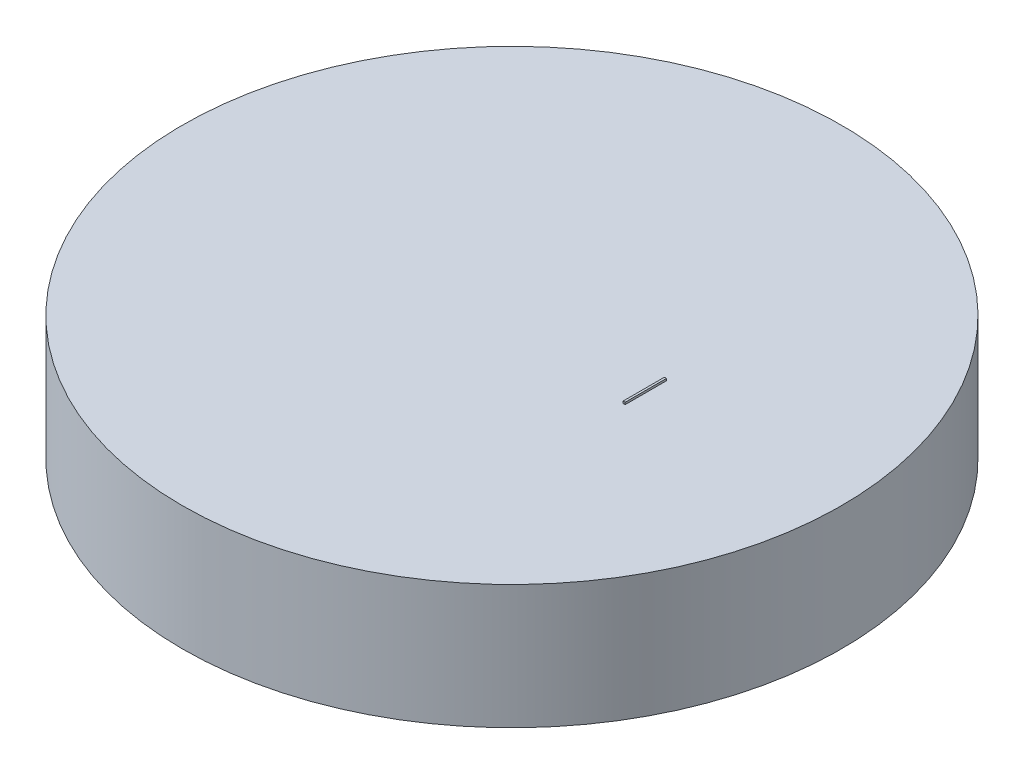
ISO-10303-21;
HEADER;
FILE_DESCRIPTION(('STEP AP214'),'2;1');
FILE_NAME('part.step','',(''),(''),'','','');
FILE_SCHEMA(('AUTOMOTIVE_DESIGN { 1 0 10303 214 1 1 1 1 }'));
ENDSEC;
DATA;
#1=APPLICATION_CONTEXT('core data for automotive mechanical design processes');
#2=APPLICATION_PROTOCOL_DEFINITION('international standard','automotive_design',2000,#1);
#3=PRODUCT_CONTEXT('',#1,'mechanical');
#4=PRODUCT('Part','Part','',(#3));
#5=PRODUCT_RELATED_PRODUCT_CATEGORY('part','',(#4));
#6=PRODUCT_DEFINITION_FORMATION('','',#4);
#7=PRODUCT_DEFINITION_CONTEXT('part definition',#1,'design');
#8=PRODUCT_DEFINITION('design','',#6,#7);
#9=PRODUCT_DEFINITION_SHAPE('','',#8);
#10=(LENGTH_UNIT() NAMED_UNIT(*) SI_UNIT(.MILLI.,.METRE.));
#11=(NAMED_UNIT(*) PLANE_ANGLE_UNIT() SI_UNIT($,.RADIAN.));
#12=(NAMED_UNIT(*) SI_UNIT($,.STERADIAN.) SOLID_ANGLE_UNIT());
#13=UNCERTAINTY_MEASURE_WITH_UNIT(LENGTH_MEASURE(1.E-05),#10,'distance_accuracy_value','');
#14=(GEOMETRIC_REPRESENTATION_CONTEXT(3) GLOBAL_UNCERTAINTY_ASSIGNED_CONTEXT((#13)) GLOBAL_UNIT_ASSIGNED_CONTEXT((#10,
#11,#12)) REPRESENTATION_CONTEXT('',''));
#15=CARTESIAN_POINT('',(0.,0.,0.));
#16=DIRECTION('',(0.,0.,1.));
#17=DIRECTION('',(1.,0.,0.));
#18=AXIS2_PLACEMENT_3D('',#15,#16,#17);
#19=CARTESIAN_POINT('',(0.,60.,0.));
#20=DIRECTION('',(0.,-1.,0.));
#21=DIRECTION('',(0.,0.,-1.));
#22=AXIS2_PLACEMENT_3D('',#19,#20,#21);
#23=CYLINDRICAL_SURFACE('',#22,159.375);
#24=CARTESIAN_POINT('',(0.,60.,0.));
#25=DIRECTION('',(0.,1.,0.));
#26=DIRECTION('',(0.,0.,1.));
#27=AXIS2_PLACEMENT_3D('',#24,#25,#26);
#28=CIRCLE('',#27,159.375);
#29=CARTESIAN_POINT('',(0.,60.,159.375));
#30=VERTEX_POINT('',#29);
#31=EDGE_CURVE('E11',#30,#30,#28,.T.);
#32=ORIENTED_EDGE('',*,*,#31,.F.);
#33=EDGE_LOOP('',(#32));
#34=FACE_BOUND('',#33,.T.);
#35=CARTESIAN_POINT('',(0.,0.,0.));
#36=DIRECTION('',(0.,1.,0.));
#37=DIRECTION('',(0.,0.,1.));
#38=AXIS2_PLACEMENT_3D('',#35,#36,#37);
#39=CIRCLE('',#38,159.375);
#40=CARTESIAN_POINT('',(0.,0.,159.375));
#41=VERTEX_POINT('',#40);
#42=EDGE_CURVE('E44',#41,#41,#39,.T.);
#43=ORIENTED_EDGE('',*,*,#42,.T.);
#44=EDGE_LOOP('',(#43));
#45=FACE_BOUND('',#44,.T.);
#46=ADVANCED_FACE('F41',(#34,#45),#23,.T.);
#47=CARTESIAN_POINT('',(0.,60.,0.));
#48=DIRECTION('',(0.,1.,0.));
#49=DIRECTION('',(0.,0.,1.));
#50=AXIS2_PLACEMENT_3D('',#47,#48,#49);
#51=PLANE('',#50);
#52=DIRECTION('',(0.,0.,-1.));
#53=VECTOR('',#52,1.);
#54=CARTESIAN_POINT('',(63.75,60.,0.));
#55=LINE('',#54,#53);
#56=CARTESIAN_POINT('',(63.75,60.,9.990395));
#57=VERTEX_POINT('',#56);
#58=CARTESIAN_POINT('',(63.75,60.,-9.990395));
#59=VERTEX_POINT('',#58);
#60=EDGE_CURVE('E112',#57,#59,#55,.T.);
#61=ORIENTED_EDGE('',*,*,#60,.T.);
#62=DIRECTION('',(-1.,0.,0.));
#63=VECTOR('',#62,1.);
#64=CARTESIAN_POINT('',(0.,60.,-9.99039500000011));
#65=LINE('',#64,#63);
#66=CARTESIAN_POINT('',(64.75,60.,-9.990395));
#67=VERTEX_POINT('',#66);
#68=EDGE_CURVE('E121',#67,#59,#65,.T.);
#69=ORIENTED_EDGE('',*,*,#68,.F.);
#70=DIRECTION('',(0.,0.,-1.));
#71=VECTOR('',#70,1.);
#72=CARTESIAN_POINT('',(64.75,60.,0.));
#73=LINE('',#72,#71);
#74=CARTESIAN_POINT('',(64.75,60.,9.990395));
#75=VERTEX_POINT('',#74);
#76=EDGE_CURVE('E118',#75,#67,#73,.T.);
#77=ORIENTED_EDGE('',*,*,#76,.F.);
#78=DIRECTION('',(1.,0.,0.));
#79=VECTOR('',#78,1.);
#80=CARTESIAN_POINT('',(0.,60.,9.990395));
#81=LINE('',#80,#79);
#82=EDGE_CURVE('E100',#57,#75,#81,.T.);
#83=ORIENTED_EDGE('',*,*,#82,.F.);
#84=EDGE_LOOP('',(#61,#69,#77,#83));
#85=FACE_BOUND('',#84,.T.);
#86=ORIENTED_EDGE('',*,*,#31,.T.);
#87=EDGE_LOOP('',(#86));
#88=FACE_BOUND('',#87,.T.);
#89=ADVANCED_FACE('F137',(#85,#88),#51,.T.);
#90=CARTESIAN_POINT('',(0.,0.,0.));
#91=DIRECTION('',(0.,1.,0.));
#92=DIRECTION('',(0.,0.,1.));
#93=AXIS2_PLACEMENT_3D('',#90,#91,#92);
#94=PLANE('',#93);
#95=ORIENTED_EDGE('',*,*,#42,.F.);
#96=EDGE_LOOP('',(#95));
#97=FACE_BOUND('',#96,.T.);
#98=ADVANCED_FACE('F134',(#97),#94,.F.);
#99=CARTESIAN_POINT('',(63.75,61.,0.));
#100=DIRECTION('',(-1.,0.,0.));
#101=DIRECTION('',(0.,0.,1.));
#102=AXIS2_PLACEMENT_3D('',#99,#100,#101);
#103=PLANE('',#102);
#104=ORIENTED_EDGE('',*,*,#60,.F.);
#105=DIRECTION('',(0.,-1.,0.));
#106=VECTOR('',#105,1.);
#107=CARTESIAN_POINT('',(63.75,61.,9.990395));
#108=LINE('',#107,#106);
#109=CARTESIAN_POINT('',(63.75,61.,9.990395));
#110=VERTEX_POINT('',#109);
#111=EDGE_CURVE('E84',#110,#57,#108,.T.);
#112=ORIENTED_EDGE('',*,*,#111,.F.);
#113=DIRECTION('',(0.,0.,-1.));
#114=VECTOR('',#113,1.);
#115=CARTESIAN_POINT('',(63.75,61.,0.));
#116=LINE('',#115,#114);
#117=CARTESIAN_POINT('',(63.75,61.,-9.990395));
#118=VERTEX_POINT('',#117);
#119=EDGE_CURVE('E92',#110,#118,#116,.T.);
#120=ORIENTED_EDGE('',*,*,#119,.T.);
#121=DIRECTION('',(0.,-1.,0.));
#122=VECTOR('',#121,1.);
#123=CARTESIAN_POINT('',(63.75,61.,-9.990395));
#124=LINE('',#123,#122);
#125=EDGE_CURVE('E81',#118,#59,#124,.T.);
#126=ORIENTED_EDGE('',*,*,#125,.T.);
#127=EDGE_LOOP('',(#104,#112,#120,#126));
#128=FACE_BOUND('',#127,.T.);
#129=ADVANCED_FACE('F136',(#128),#103,.T.);
#130=CARTESIAN_POINT('',(0.,61.,9.990395));
#131=DIRECTION('',(0.,0.,-1.));
#132=DIRECTION('',(-1.,0.,0.));
#133=AXIS2_PLACEMENT_3D('',#130,#131,#132);
#134=PLANE('',#133);
#135=ORIENTED_EDGE('',*,*,#82,.T.);
#136=DIRECTION('',(0.,-1.,0.));
#137=VECTOR('',#136,1.);
#138=CARTESIAN_POINT('',(64.75,61.,9.990395));
#139=LINE('',#138,#137);
#140=CARTESIAN_POINT('',(64.75,61.,9.990395));
#141=VERTEX_POINT('',#140);
#142=EDGE_CURVE('E97',#141,#75,#139,.T.);
#143=ORIENTED_EDGE('',*,*,#142,.F.);
#144=DIRECTION('',(1.,0.,0.));
#145=VECTOR('',#144,1.);
#146=CARTESIAN_POINT('',(0.,61.,9.990395));
#147=LINE('',#146,#145);
#148=EDGE_CURVE('E87',#110,#141,#147,.T.);
#149=ORIENTED_EDGE('',*,*,#148,.F.);
#150=ORIENTED_EDGE('',*,*,#111,.T.);
#151=EDGE_LOOP('',(#135,#143,#149,#150));
#152=FACE_BOUND('',#151,.T.);
#153=ADVANCED_FACE('F98',(#152),#134,.F.);
#154=CARTESIAN_POINT('',(64.75,61.,0.));
#155=DIRECTION('',(-1.,0.,0.));
#156=DIRECTION('',(0.,0.,1.));
#157=AXIS2_PLACEMENT_3D('',#154,#155,#156);
#158=PLANE('',#157);
#159=ORIENTED_EDGE('',*,*,#76,.T.);
#160=DIRECTION('',(0.,-1.,0.));
#161=VECTOR('',#160,1.);
#162=CARTESIAN_POINT('',(64.75,61.,-9.990395));
#163=LINE('',#162,#161);
#164=CARTESIAN_POINT('',(64.75,61.,-9.990395));
#165=VERTEX_POINT('',#164);
#166=EDGE_CURVE('E56',#165,#67,#163,.T.);
#167=ORIENTED_EDGE('',*,*,#166,.F.);
#168=DIRECTION('',(0.,0.,-1.));
#169=VECTOR('',#168,1.);
#170=CARTESIAN_POINT('',(64.75,61.,0.));
#171=LINE('',#170,#169);
#172=EDGE_CURVE('E91',#141,#165,#171,.T.);
#173=ORIENTED_EDGE('',*,*,#172,.F.);
#174=ORIENTED_EDGE('',*,*,#142,.T.);
#175=EDGE_LOOP('',(#159,#167,#173,#174));
#176=FACE_BOUND('',#175,.T.);
#177=ADVANCED_FACE('F105',(#176),#158,.F.);
#178=CARTESIAN_POINT('',(0.,61.,-9.99039500000011));
#179=DIRECTION('',(0.,0.,1.));
#180=DIRECTION('',(1.,0.,0.));
#181=AXIS2_PLACEMENT_3D('',#178,#179,#180);
#182=PLANE('',#181);
#183=ORIENTED_EDGE('',*,*,#68,.T.);
#184=ORIENTED_EDGE('',*,*,#125,.F.);
#185=DIRECTION('',(-1.,0.,0.));
#186=VECTOR('',#185,1.);
#187=CARTESIAN_POINT('',(0.,61.,-9.99039500000011));
#188=LINE('',#187,#186);
#189=EDGE_CURVE('E64',#165,#118,#188,.T.);
#190=ORIENTED_EDGE('',*,*,#189,.F.);
#191=ORIENTED_EDGE('',*,*,#166,.T.);
#192=EDGE_LOOP('',(#183,#184,#190,#191));
#193=FACE_BOUND('',#192,.T.);
#194=ADVANCED_FACE('F181',(#193),#182,.F.);
#195=CARTESIAN_POINT('',(0.,61.,0.));
#196=DIRECTION('',(0.,1.,0.));
#197=DIRECTION('',(0.,0.,1.));
#198=AXIS2_PLACEMENT_3D('',#195,#196,#197);
#199=PLANE('',#198);
#200=ORIENTED_EDGE('',*,*,#119,.F.);
#201=ORIENTED_EDGE('',*,*,#148,.T.);
#202=ORIENTED_EDGE('',*,*,#172,.T.);
#203=ORIENTED_EDGE('',*,*,#189,.T.);
#204=EDGE_LOOP('',(#200,#201,#202,#203));
#205=FACE_BOUND('',#204,.T.);
#206=ADVANCED_FACE('F89',(#205),#199,.T.);
#207=CLOSED_SHELL('',(#46,#89,#98,#129,#153,#177,#194,#206));
#208=MANIFOLD_SOLID_BREP('B2',#207);
#209=ADVANCED_BREP_SHAPE_REPRESENTATION('',(#18,#208),#14);
#210=SHAPE_DEFINITION_REPRESENTATION(#9,#209);
ENDSEC;
END-ISO-10303-21;
